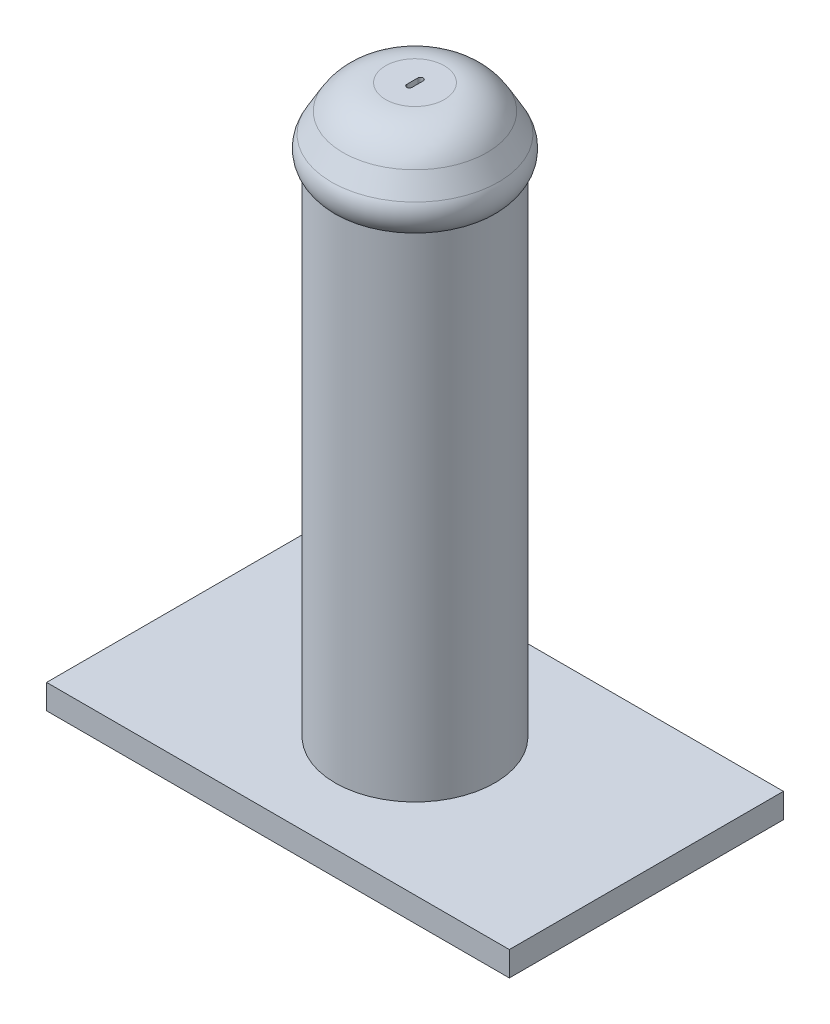
ISO-10303-21;
HEADER;
FILE_DESCRIPTION(('STEP AP214'),'2;1');
FILE_NAME('part.step','',(''),(''),'','','');
FILE_SCHEMA(('AUTOMOTIVE_DESIGN { 1 0 10303 214 1 1 1 1 }'));
ENDSEC;
DATA;
#1=APPLICATION_CONTEXT('core data for automotive mechanical design processes');
#2=APPLICATION_PROTOCOL_DEFINITION('international standard','automotive_design',2000,#1);
#3=PRODUCT_CONTEXT('',#1,'mechanical');
#4=PRODUCT('Part','Part','',(#3));
#5=PRODUCT_RELATED_PRODUCT_CATEGORY('part','',(#4));
#6=PRODUCT_DEFINITION_FORMATION('','',#4);
#7=PRODUCT_DEFINITION_CONTEXT('part definition',#1,'design');
#8=PRODUCT_DEFINITION('design','',#6,#7);
#9=PRODUCT_DEFINITION_SHAPE('','',#8);
#10=(LENGTH_UNIT() NAMED_UNIT(*) SI_UNIT(.MILLI.,.METRE.));
#11=(NAMED_UNIT(*) PLANE_ANGLE_UNIT() SI_UNIT($,.RADIAN.));
#12=(NAMED_UNIT(*) SI_UNIT($,.STERADIAN.) SOLID_ANGLE_UNIT());
#13=UNCERTAINTY_MEASURE_WITH_UNIT(LENGTH_MEASURE(1.E-05),#10,'distance_accuracy_value','');
#14=(GEOMETRIC_REPRESENTATION_CONTEXT(3) GLOBAL_UNCERTAINTY_ASSIGNED_CONTEXT((#13)) GLOBAL_UNIT_ASSIGNED_CONTEXT((#10,
#11,#12)) REPRESENTATION_CONTEXT('',''));
#15=CARTESIAN_POINT('',(0.,0.,0.));
#16=DIRECTION('',(0.,0.,1.));
#17=DIRECTION('',(1.,0.,0.));
#18=AXIS2_PLACEMENT_3D('',#15,#16,#17);
#19=CARTESIAN_POINT('',(0.,200.,0.));
#20=DIRECTION('',(0.,-1.,0.));
#21=DIRECTION('',(0.,0.,-1.));
#22=AXIS2_PLACEMENT_3D('',#19,#20,#21);
#23=CYLINDRICAL_SURFACE('',#22,32.411320862997);
#24=CARTESIAN_POINT('',(0.,200.,0.));
#25=DIRECTION('',(0.,1.,0.));
#26=DIRECTION('',(0.,0.,1.));
#27=AXIS2_PLACEMENT_3D('',#24,#25,#26);
#28=CIRCLE('',#27,32.411320862997);
#29=CARTESIAN_POINT('',(0.,200.,32.411320862997));
#30=VERTEX_POINT('',#29);
#31=EDGE_CURVE('E183',#30,#30,#28,.T.);
#32=ORIENTED_EDGE('',*,*,#31,.F.);
#33=EDGE_LOOP('',(#32));
#34=FACE_BOUND('',#33,.T.);
#35=CARTESIAN_POINT('',(0.,0.,0.));
#36=DIRECTION('',(0.,1.,0.));
#37=DIRECTION('',(0.,0.,1.));
#38=AXIS2_PLACEMENT_3D('',#35,#36,#37);
#39=CIRCLE('',#38,32.411320862997);
#40=CARTESIAN_POINT('',(0.,0.,32.411320862997));
#41=VERTEX_POINT('',#40);
#42=EDGE_CURVE('E142',#41,#41,#39,.T.);
#43=ORIENTED_EDGE('',*,*,#42,.T.);
#44=EDGE_LOOP('',(#43));
#45=FACE_BOUND('',#44,.T.);
#46=ADVANCED_FACE('F45',(#34,#45),#23,.T.);
#47=CARTESIAN_POINT('',(0.,200.,0.));
#48=DIRECTION('',(0.,-1.,0.));
#49=DIRECTION('',(0.,0.,1.));
#50=AXIS2_PLACEMENT_3D('',#47,#48,#49);
#51=CONICAL_SURFACE('',#50,40.7644417064682,0.523598775598299);
#52=CARTESIAN_POINT('',(0.,220.,0.));
#53=DIRECTION('',(0.,-1.,0.));
#54=DIRECTION('',(0.,0.,-1.));
#55=AXIS2_PLACEMENT_3D('',#52,#53,#54);
#56=CIRCLE('',#55,29.2174363226757);
#57=CARTESIAN_POINT('',(0.,220.,-29.2174363226757));
#58=VERTEX_POINT('',#57);
#59=EDGE_CURVE('E11',#58,#58,#56,.T.);
#60=ORIENTED_EDGE('',*,*,#59,.T.);
#61=EDGE_LOOP('',(#60));
#62=FACE_BOUND('',#61,.T.);
#63=CARTESIAN_POINT('',(0.,211.939386569754,0.));
#64=DIRECTION('',(0.,1.,0.));
#65=DIRECTION('',(0.,0.,1.));
#66=AXIS2_PLACEMENT_3D('',#63,#64,#65);
#67=CIRCLE('',#66,33.8712336564616);
#68=CARTESIAN_POINT('',(0.,211.939386569754,33.8712336564616));
#69=VERTEX_POINT('',#68);
#70=EDGE_CURVE('E194',#69,#69,#67,.T.);
#71=ORIENTED_EDGE('',*,*,#70,.T.);
#72=EDGE_LOOP('',(#71));
#73=FACE_BOUND('',#72,.T.);
#74=ADVANCED_FACE('F217',(#62,#73),#51,.T.);
#75=CARTESIAN_POINT('',(0.,230.,0.));
#76=DIRECTION('',(0.,1.,0.));
#77=DIRECTION('',(0.,0.,1.));
#78=AXIS2_PLACEMENT_3D('',#75,#76,#77);
#79=PLANE('',#78);
#80=CARTESIAN_POINT('',(0.,230.,-2.25831527891876));
#81=DIRECTION('',(0.,1.,0.));
#82=DIRECTION('',(0.,0.,1.));
#83=AXIS2_PLACEMENT_3D('',#80,#81,#82);
#84=CIRCLE('',#83,1.07072498511903);
#85=CARTESIAN_POINT('',(1.07072498511903,230.,-2.25831527891876));
#86=VERTEX_POINT('',#85);
#87=CARTESIAN_POINT('',(-1.07072498511903,230.,-2.25831527891876));
#88=VERTEX_POINT('',#87);
#89=EDGE_CURVE('E61',#86,#88,#84,.T.);
#90=ORIENTED_EDGE('',*,*,#89,.F.);
#91=DIRECTION('',(0.,0.,-1.));
#92=VECTOR('',#91,1.);
#93=CARTESIAN_POINT('',(1.07072498511903,230.,-2.25831527891876));
#94=LINE('',#93,#92);
#95=CARTESIAN_POINT('',(1.07072498511903,230.,2.25831527891876));
#96=VERTEX_POINT('',#95);
#97=EDGE_CURVE('E157',#96,#86,#94,.T.);
#98=ORIENTED_EDGE('',*,*,#97,.F.);
#99=CARTESIAN_POINT('',(0.,230.,2.25831527891876));
#100=DIRECTION('',(0.,1.,0.));
#101=DIRECTION('',(0.,0.,1.));
#102=AXIS2_PLACEMENT_3D('',#99,#100,#101);
#103=CIRCLE('',#102,1.07072498511903);
#104=CARTESIAN_POINT('',(-1.07072498511903,230.,2.25831527891876));
#105=VERTEX_POINT('',#104);
#106=EDGE_CURVE('E175',#105,#96,#103,.T.);
#107=ORIENTED_EDGE('',*,*,#106,.F.);
#108=DIRECTION('',(0.,0.,1.));
#109=VECTOR('',#108,1.);
#110=CARTESIAN_POINT('',(-1.07072498511903,230.,-2.25831527891876));
#111=LINE('',#110,#109);
#112=EDGE_CURVE('E171',#88,#105,#111,.T.);
#113=ORIENTED_EDGE('',*,*,#112,.F.);
#114=EDGE_LOOP('',(#90,#98,#107,#113));
#115=FACE_BOUND('',#114,.T.);
#116=CARTESIAN_POINT('',(0.,230.,0.));
#117=DIRECTION('',(0.,1.,0.));
#118=DIRECTION('',(0.,0.,1.));
#119=AXIS2_PLACEMENT_3D('',#116,#117,#118);
#120=CIRCLE('',#119,11.8969282469869);
#121=CARTESIAN_POINT('',(0.,230.,11.8969282469869));
#122=VERTEX_POINT('',#121);
#123=EDGE_CURVE('E54',#122,#122,#120,.T.);
#124=ORIENTED_EDGE('',*,*,#123,.T.);
#125=EDGE_LOOP('',(#124));
#126=FACE_BOUND('',#125,.T.);
#127=ADVANCED_FACE('F202',(#115,#126),#79,.T.);
#128=CARTESIAN_POINT('',(0.,206.939386569754,0.));
#129=DIRECTION('',(0.,-1.,0.));
#130=DIRECTION('',(0.,0.,-1.));
#131=AXIS2_PLACEMENT_3D('',#128,#129,#130);
#132=TOROIDAL_SURFACE('',#131,25.2109796186172,10.);
#133=ORIENTED_EDGE('',*,*,#31,.T.);
#134=EDGE_LOOP('',(#133));
#135=FACE_BOUND('',#134,.T.);
#136=ORIENTED_EDGE('',*,*,#70,.F.);
#137=EDGE_LOOP('',(#136));
#138=FACE_BOUND('',#137,.T.);
#139=ADVANCED_FACE('F206',(#135,#138),#132,.T.);
#140=CARTESIAN_POINT('',(0.,210.,0.));
#141=DIRECTION('',(0.,1.,0.));
#142=DIRECTION('',(0.,0.,1.));
#143=AXIS2_PLACEMENT_3D('',#140,#141,#142);
#144=DEGENERATE_TOROIDAL_SURFACE('',#143,11.8969282469869,20.,.T.);
#145=ORIENTED_EDGE('',*,*,#59,.F.);
#146=EDGE_LOOP('',(#145));
#147=FACE_BOUND('',#146,.T.);
#148=ORIENTED_EDGE('',*,*,#123,.F.);
#149=EDGE_LOOP('',(#148));
#150=FACE_BOUND('',#149,.T.);
#151=ADVANCED_FACE('F47',(#147,#150),#144,.T.);
#152=CARTESIAN_POINT('',(0.,220.,-2.25831527891876));
#153=DIRECTION('',(0.,1.,0.));
#154=DIRECTION('',(0.,0.,1.));
#155=AXIS2_PLACEMENT_3D('',#152,#153,#154);
#156=CYLINDRICAL_SURFACE('',#155,1.07072498511903);
#157=ORIENTED_EDGE('',*,*,#89,.T.);
#158=DIRECTION('',(0.,1.,0.));
#159=VECTOR('',#158,1.);
#160=CARTESIAN_POINT('',(-1.07072498511903,220.,-2.25831527891876));
#161=LINE('',#160,#159);
#162=CARTESIAN_POINT('',(-1.07072498511903,220.,-2.25831527891876));
#163=VERTEX_POINT('',#162);
#164=EDGE_CURVE('E85',#163,#88,#161,.T.);
#165=ORIENTED_EDGE('',*,*,#164,.F.);
#166=CARTESIAN_POINT('',(0.,220.,-2.25831527891876));
#167=DIRECTION('',(0.,1.,0.));
#168=DIRECTION('',(0.,0.,1.));
#169=AXIS2_PLACEMENT_3D('',#166,#167,#168);
#170=CIRCLE('',#169,1.07072498511903);
#171=CARTESIAN_POINT('',(1.07072498511903,220.,-2.25831527891876));
#172=VERTEX_POINT('',#171);
#173=EDGE_CURVE('E152',#172,#163,#170,.T.);
#174=ORIENTED_EDGE('',*,*,#173,.F.);
#175=DIRECTION('',(0.,1.,0.));
#176=VECTOR('',#175,1.);
#177=CARTESIAN_POINT('',(1.07072498511903,220.,-2.25831527891876));
#178=LINE('',#177,#176);
#179=EDGE_CURVE('E69',#172,#86,#178,.T.);
#180=ORIENTED_EDGE('',*,*,#179,.T.);
#181=EDGE_LOOP('',(#157,#165,#174,#180));
#182=FACE_BOUND('',#181,.T.);
#183=ADVANCED_FACE('F205',(#182),#156,.F.);
#184=CARTESIAN_POINT('',(1.07072498511903,220.,-2.25831527891876));
#185=DIRECTION('',(1.,0.,0.));
#186=DIRECTION('',(0.,0.,-1.));
#187=AXIS2_PLACEMENT_3D('',#184,#185,#186);
#188=PLANE('',#187);
#189=ORIENTED_EDGE('',*,*,#97,.T.);
#190=ORIENTED_EDGE('',*,*,#179,.F.);
#191=DIRECTION('',(0.,0.,-1.));
#192=VECTOR('',#191,1.);
#193=CARTESIAN_POINT('',(1.07072498511903,220.,-2.25831527891876));
#194=LINE('',#193,#192);
#195=CARTESIAN_POINT('',(1.07072498511903,220.,2.25831527891876));
#196=VERTEX_POINT('',#195);
#197=EDGE_CURVE('E165',#196,#172,#194,.T.);
#198=ORIENTED_EDGE('',*,*,#197,.F.);
#199=DIRECTION('',(0.,1.,0.));
#200=VECTOR('',#199,1.);
#201=CARTESIAN_POINT('',(1.07072498511903,220.,2.25831527891876));
#202=LINE('',#201,#200);
#203=EDGE_CURVE('E184',#196,#96,#202,.T.);
#204=ORIENTED_EDGE('',*,*,#203,.T.);
#205=EDGE_LOOP('',(#189,#190,#198,#204));
#206=FACE_BOUND('',#205,.T.);
#207=ADVANCED_FACE('F212',(#206),#188,.F.);
#208=CARTESIAN_POINT('',(0.,220.,2.25831527891876));
#209=DIRECTION('',(0.,1.,0.));
#210=DIRECTION('',(0.,0.,1.));
#211=AXIS2_PLACEMENT_3D('',#208,#209,#210);
#212=CYLINDRICAL_SURFACE('',#211,1.07072498511903);
#213=ORIENTED_EDGE('',*,*,#106,.T.);
#214=ORIENTED_EDGE('',*,*,#203,.F.);
#215=CARTESIAN_POINT('',(0.,220.,2.25831527891876));
#216=DIRECTION('',(0.,1.,0.));
#217=DIRECTION('',(0.,0.,1.));
#218=AXIS2_PLACEMENT_3D('',#215,#216,#217);
#219=CIRCLE('',#218,1.07072498511903);
#220=CARTESIAN_POINT('',(-1.07072498511903,220.,2.25831527891876));
#221=VERTEX_POINT('',#220);
#222=EDGE_CURVE('E161',#221,#196,#219,.T.);
#223=ORIENTED_EDGE('',*,*,#222,.F.);
#224=DIRECTION('',(0.,1.,0.));
#225=VECTOR('',#224,1.);
#226=CARTESIAN_POINT('',(-1.07072498511903,220.,2.25831527891876));
#227=LINE('',#226,#225);
#228=EDGE_CURVE('E187',#221,#105,#227,.T.);
#229=ORIENTED_EDGE('',*,*,#228,.T.);
#230=EDGE_LOOP('',(#213,#214,#223,#229));
#231=FACE_BOUND('',#230,.T.);
#232=ADVANCED_FACE('F235',(#231),#212,.F.);
#233=CARTESIAN_POINT('',(-1.07072498511903,220.,-2.25831527891876));
#234=DIRECTION('',(-1.,0.,0.));
#235=DIRECTION('',(0.,0.,1.));
#236=AXIS2_PLACEMENT_3D('',#233,#234,#235);
#237=PLANE('',#236);
#238=ORIENTED_EDGE('',*,*,#112,.T.);
#239=ORIENTED_EDGE('',*,*,#228,.F.);
#240=DIRECTION('',(0.,0.,1.));
#241=VECTOR('',#240,1.);
#242=CARTESIAN_POINT('',(-1.07072498511903,220.,-2.25831527891876));
#243=LINE('',#242,#241);
#244=EDGE_CURVE('E156',#163,#221,#243,.T.);
#245=ORIENTED_EDGE('',*,*,#244,.F.);
#246=ORIENTED_EDGE('',*,*,#164,.T.);
#247=EDGE_LOOP('',(#238,#239,#245,#246));
#248=FACE_BOUND('',#247,.T.);
#249=ADVANCED_FACE('F231',(#248),#237,.F.);
#250=CARTESIAN_POINT('',(0.,220.,-2.25831527891876));
#251=DIRECTION('',(0.,1.,0.));
#252=DIRECTION('',(0.,0.,1.));
#253=AXIS2_PLACEMENT_3D('',#250,#251,#252);
#254=PLANE('',#253);
#255=ORIENTED_EDGE('',*,*,#173,.T.);
#256=ORIENTED_EDGE('',*,*,#244,.T.);
#257=ORIENTED_EDGE('',*,*,#222,.T.);
#258=ORIENTED_EDGE('',*,*,#197,.T.);
#259=EDGE_LOOP('',(#255,#256,#257,#258));
#260=FACE_BOUND('',#259,.T.);
#261=ADVANCED_FACE('F234',(#260),#254,.T.);
#262=CARTESIAN_POINT('',(93.9262763680589,-10.,55.6275975467251));
#263=DIRECTION('',(-1.,0.,0.));
#264=DIRECTION('',(0.,0.,1.));
#265=AXIS2_PLACEMENT_3D('',#262,#263,#264);
#266=PLANE('',#265);
#267=DIRECTION('',(0.,0.,1.));
#268=VECTOR('',#267,1.);
#269=CARTESIAN_POINT('',(93.9262763680589,0.,55.6275975467251));
#270=LINE('',#269,#268);
#271=CARTESIAN_POINT('',(93.9262763680589,0.,-55.6275975467251));
#272=VERTEX_POINT('',#271);
#273=CARTESIAN_POINT('',(93.9262763680589,0.,55.6275975467251));
#274=VERTEX_POINT('',#273);
#275=EDGE_CURVE('E140',#272,#274,#270,.T.);
#276=ORIENTED_EDGE('',*,*,#275,.T.);
#277=DIRECTION('',(0.,1.,0.));
#278=VECTOR('',#277,1.);
#279=CARTESIAN_POINT('',(93.9262763680589,-10.,55.6275975467251));
#280=LINE('',#279,#278);
#281=CARTESIAN_POINT('',(93.9262763680589,-10.,55.6275975467251));
#282=VERTEX_POINT('',#281);
#283=EDGE_CURVE('E118',#282,#274,#280,.T.);
#284=ORIENTED_EDGE('',*,*,#283,.F.);
#285=DIRECTION('',(0.,0.,1.));
#286=VECTOR('',#285,1.);
#287=CARTESIAN_POINT('',(93.9262763680589,-10.,55.6275975467251));
#288=LINE('',#287,#286);
#289=CARTESIAN_POINT('',(93.9262763680589,-10.,-55.6275975467251));
#290=VERTEX_POINT('',#289);
#291=EDGE_CURVE('E126',#290,#282,#288,.T.);
#292=ORIENTED_EDGE('',*,*,#291,.F.);
#293=DIRECTION('',(0.,1.,0.));
#294=VECTOR('',#293,1.);
#295=CARTESIAN_POINT('',(93.9262763680589,-10.,-55.6275975467251));
#296=LINE('',#295,#294);
#297=EDGE_CURVE('E413',#290,#272,#296,.T.);
#298=ORIENTED_EDGE('',*,*,#297,.T.);
#299=EDGE_LOOP('',(#276,#284,#292,#298));
#300=FACE_BOUND('',#299,.T.);
#301=ADVANCED_FACE('F138',(#300),#266,.F.);
#302=CARTESIAN_POINT('',(-93.9262763680589,-10.,55.6275975467251));
#303=DIRECTION('',(0.,0.,-1.));
#304=DIRECTION('',(-1.,0.,0.));
#305=AXIS2_PLACEMENT_3D('',#302,#303,#304);
#306=PLANE('',#305);
#307=DIRECTION('',(-1.,0.,0.));
#308=VECTOR('',#307,1.);
#309=CARTESIAN_POINT('',(-93.9262763680589,0.,55.6275975467251));
#310=LINE('',#309,#308);
#311=CARTESIAN_POINT('',(-93.9262763680589,0.,55.6275975467251));
#312=VERTEX_POINT('',#311);
#313=EDGE_CURVE('E400',#274,#312,#310,.T.);
#314=ORIENTED_EDGE('',*,*,#313,.T.);
#315=DIRECTION('',(0.,1.,0.));
#316=VECTOR('',#315,1.);
#317=CARTESIAN_POINT('',(-93.9262763680589,-10.,55.6275975467251));
#318=LINE('',#317,#316);
#319=CARTESIAN_POINT('',(-93.9262763680589,-10.,55.6275975467251));
#320=VERTEX_POINT('',#319);
#321=EDGE_CURVE('E121',#320,#312,#318,.T.);
#322=ORIENTED_EDGE('',*,*,#321,.F.);
#323=DIRECTION('',(-1.,0.,0.));
#324=VECTOR('',#323,1.);
#325=CARTESIAN_POINT('',(-93.9262763680589,-10.,55.6275975467251));
#326=LINE('',#325,#324);
#327=EDGE_CURVE('E114',#282,#320,#326,.T.);
#328=ORIENTED_EDGE('',*,*,#327,.F.);
#329=ORIENTED_EDGE('',*,*,#283,.T.);
#330=EDGE_LOOP('',(#314,#322,#328,#329));
#331=FACE_BOUND('',#330,.T.);
#332=ADVANCED_FACE('F116',(#331),#306,.F.);
#333=CARTESIAN_POINT('',(-93.9262763680589,-10.,55.6275975467251));
#334=DIRECTION('',(1.,0.,0.));
#335=DIRECTION('',(0.,0.,-1.));
#336=AXIS2_PLACEMENT_3D('',#333,#334,#335);
#337=PLANE('',#336);
#338=DIRECTION('',(0.,0.,-1.));
#339=VECTOR('',#338,1.);
#340=CARTESIAN_POINT('',(-93.9262763680589,0.,55.6275975467251));
#341=LINE('',#340,#339);
#342=CARTESIAN_POINT('',(-93.9262763680589,0.,-55.6275975467251));
#343=VERTEX_POINT('',#342);
#344=EDGE_CURVE('E404',#312,#343,#341,.T.);
#345=ORIENTED_EDGE('',*,*,#344,.T.);
#346=DIRECTION('',(0.,1.,0.));
#347=VECTOR('',#346,1.);
#348=CARTESIAN_POINT('',(-93.9262763680589,-10.,-55.6275975467251));
#349=LINE('',#348,#347);
#350=CARTESIAN_POINT('',(-93.9262763680589,-10.,-55.6275975467251));
#351=VERTEX_POINT('',#350);
#352=EDGE_CURVE('E148',#351,#343,#349,.T.);
#353=ORIENTED_EDGE('',*,*,#352,.F.);
#354=DIRECTION('',(0.,0.,-1.));
#355=VECTOR('',#354,1.);
#356=CARTESIAN_POINT('',(-93.9262763680589,-10.,55.6275975467251));
#357=LINE('',#356,#355);
#358=EDGE_CURVE('E125',#320,#351,#357,.T.);
#359=ORIENTED_EDGE('',*,*,#358,.F.);
#360=ORIENTED_EDGE('',*,*,#321,.T.);
#361=EDGE_LOOP('',(#345,#353,#359,#360));
#362=FACE_BOUND('',#361,.T.);
#363=ADVANCED_FACE('F249',(#362),#337,.F.);
#364=CARTESIAN_POINT('',(-93.9262763680589,-10.,-55.6275975467251));
#365=DIRECTION('',(0.,0.,1.));
#366=DIRECTION('',(1.,0.,0.));
#367=AXIS2_PLACEMENT_3D('',#364,#365,#366);
#368=PLANE('',#367);
#369=DIRECTION('',(1.,0.,0.));
#370=VECTOR('',#369,1.);
#371=CARTESIAN_POINT('',(-93.9262763680589,0.,-55.6275975467251));
#372=LINE('',#371,#370);
#373=EDGE_CURVE('E136',#343,#272,#372,.T.);
#374=ORIENTED_EDGE('',*,*,#373,.T.);
#375=ORIENTED_EDGE('',*,*,#297,.F.);
#376=DIRECTION('',(1.,0.,0.));
#377=VECTOR('',#376,1.);
#378=CARTESIAN_POINT('',(-93.9262763680589,-10.,-55.6275975467251));
#379=LINE('',#378,#377);
#380=EDGE_CURVE('E131',#351,#290,#379,.T.);
#381=ORIENTED_EDGE('',*,*,#380,.F.);
#382=ORIENTED_EDGE('',*,*,#352,.T.);
#383=EDGE_LOOP('',(#374,#375,#381,#382));
#384=FACE_BOUND('',#383,.T.);
#385=ADVANCED_FACE('F252',(#384),#368,.F.);
#386=CARTESIAN_POINT('',(0.,-10.,0.));
#387=DIRECTION('',(0.,-1.,0.));
#388=DIRECTION('',(0.,0.,-1.));
#389=AXIS2_PLACEMENT_3D('',#386,#387,#388);
#390=PLANE('',#389);
#391=ORIENTED_EDGE('',*,*,#291,.T.);
#392=ORIENTED_EDGE('',*,*,#327,.T.);
#393=ORIENTED_EDGE('',*,*,#358,.T.);
#394=ORIENTED_EDGE('',*,*,#380,.T.);
#395=EDGE_LOOP('',(#391,#392,#393,#394));
#396=FACE_BOUND('',#395,.T.);
#397=ADVANCED_FACE('F129',(#396),#390,.T.);
#398=CARTESIAN_POINT('',(0.,0.,0.));
#399=DIRECTION('',(0.,-1.,0.));
#400=DIRECTION('',(0.,0.,-1.));
#401=AXIS2_PLACEMENT_3D('',#398,#399,#400);
#402=PLANE('',#401);
#403=ORIENTED_EDGE('',*,*,#42,.F.);
#404=EDGE_LOOP('',(#403));
#405=FACE_BOUND('',#404,.T.);
#406=ORIENTED_EDGE('',*,*,#275,.F.);
#407=ORIENTED_EDGE('',*,*,#373,.F.);
#408=ORIENTED_EDGE('',*,*,#344,.F.);
#409=ORIENTED_EDGE('',*,*,#313,.F.);
#410=EDGE_LOOP('',(#406,#407,#408,#409));
#411=FACE_BOUND('',#410,.T.);
#412=ADVANCED_FACE('F257',(#405,#411),#402,.F.);
#413=CLOSED_SHELL('',(#46,#74,#127,#139,#151,#183,#207,#232,#249,#261,#301,#332,#363,#385,#397,#412));
#414=MANIFOLD_SOLID_BREP('B2',#413);
#415=ADVANCED_BREP_SHAPE_REPRESENTATION('',(#18,#414),#14);
#416=SHAPE_DEFINITION_REPRESENTATION(#9,#415);
ENDSEC;
END-ISO-10303-21;
